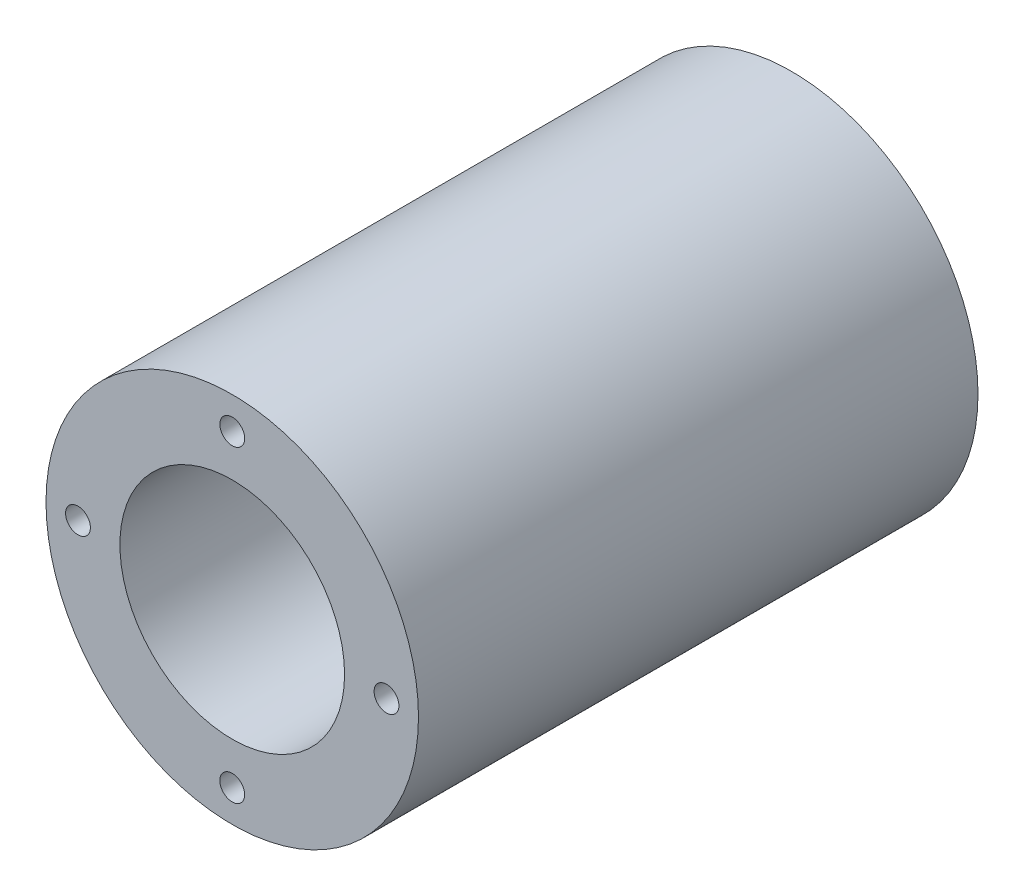
ISO-10303-21;
HEADER;
FILE_DESCRIPTION(('STEP AP214'),'2;1');
FILE_NAME('part.step','',(''),(''),'','','');
FILE_SCHEMA(('AUTOMOTIVE_DESIGN { 1 0 10303 214 1 1 1 1 }'));
ENDSEC;
DATA;
#1=APPLICATION_CONTEXT('core data for automotive mechanical design processes');
#2=APPLICATION_PROTOCOL_DEFINITION('international standard','automotive_design',2000,#1);
#3=PRODUCT_CONTEXT('',#1,'mechanical');
#4=PRODUCT('Part','Part','',(#3));
#5=PRODUCT_RELATED_PRODUCT_CATEGORY('part','',(#4));
#6=PRODUCT_DEFINITION_FORMATION('','',#4);
#7=PRODUCT_DEFINITION_CONTEXT('part definition',#1,'design');
#8=PRODUCT_DEFINITION('design','',#6,#7);
#9=PRODUCT_DEFINITION_SHAPE('','',#8);
#10=(LENGTH_UNIT() NAMED_UNIT(*) SI_UNIT(.MILLI.,.METRE.));
#11=(NAMED_UNIT(*) PLANE_ANGLE_UNIT() SI_UNIT($,.RADIAN.));
#12=(NAMED_UNIT(*) SI_UNIT($,.STERADIAN.) SOLID_ANGLE_UNIT());
#13=UNCERTAINTY_MEASURE_WITH_UNIT(LENGTH_MEASURE(1.E-05),#10,'distance_accuracy_value','');
#14=(GEOMETRIC_REPRESENTATION_CONTEXT(3) GLOBAL_UNCERTAINTY_ASSIGNED_CONTEXT((#13)) GLOBAL_UNIT_ASSIGNED_CONTEXT((#10,
#11,#12)) REPRESENTATION_CONTEXT('',''));
#15=CARTESIAN_POINT('',(0.,0.,0.));
#16=DIRECTION('',(0.,0.,1.));
#17=DIRECTION('',(1.,0.,0.));
#18=AXIS2_PLACEMENT_3D('',#15,#16,#17);
#19=CARTESIAN_POINT('',(0.,0.,23.625));
#20=DIRECTION('',(0.,0.,-1.));
#21=DIRECTION('',(-1.,0.,0.));
#22=AXIS2_PLACEMENT_3D('',#19,#20,#21);
#23=PLANE('',#22);
#24=CARTESIAN_POINT('',(0.,0.,23.625));
#25=DIRECTION('',(0.,0.,1.));
#26=DIRECTION('',(1.,0.,0.));
#27=AXIS2_PLACEMENT_3D('',#24,#25,#26);
#28=CIRCLE('',#27,22.6187);
#29=CARTESIAN_POINT('',(22.6187,0.,23.625));
#30=VERTEX_POINT('',#29);
#31=EDGE_CURVE('E48',#30,#30,#28,.T.);
#32=ORIENTED_EDGE('',*,*,#31,.T.);
#33=EDGE_LOOP('',(#32));
#34=FACE_BOUND('',#33,.T.);
#35=CARTESIAN_POINT('',(0.,0.,23.625));
#36=DIRECTION('',(0.,0.,-1.));
#37=DIRECTION('',(0.,1.,0.));
#38=AXIS2_PLACEMENT_3D('',#35,#36,#37);
#39=CIRCLE('',#38,25.4);
#40=CARTESIAN_POINT('',(0.,25.4,23.625));
#41=VERTEX_POINT('',#40);
#42=EDGE_CURVE('E499',#41,#41,#39,.T.);
#43=ORIENTED_EDGE('',*,*,#42,.T.);
#44=EDGE_LOOP('',(#43));
#45=FACE_BOUND('',#44,.T.);
#46=ADVANCED_FACE('F39',(#34,#45),#23,.T.);
#47=CARTESIAN_POINT('',(0.,0.,136.284));
#48=DIRECTION('',(0.,0.,-1.));
#49=DIRECTION('',(-1.,0.,0.));
#50=AXIS2_PLACEMENT_3D('',#47,#48,#49);
#51=PLANE('',#50);
#52=CARTESIAN_POINT('',(-31.05935,3.25329422764792E-13,136.284));
#53=DIRECTION('',(0.,0.,1.));
#54=DIRECTION('',(1.,0.,0.));
#55=AXIS2_PLACEMENT_3D('',#52,#53,#54);
#56=CIRCLE('',#55,2.5);
#57=CARTESIAN_POINT('',(-28.55935,3.25329422764792E-13,136.284));
#58=VERTEX_POINT('',#57);
#59=EDGE_CURVE('E90',#58,#58,#56,.T.);
#60=ORIENTED_EDGE('',*,*,#59,.F.);
#61=EDGE_LOOP('',(#60));
#62=FACE_BOUND('',#61,.T.);
#63=CARTESIAN_POINT('',(0.,-31.05935,136.284));
#64=DIRECTION('',(0.,0.,1.));
#65=DIRECTION('',(1.,0.,0.));
#66=AXIS2_PLACEMENT_3D('',#63,#64,#65);
#67=CIRCLE('',#66,2.5);
#68=CARTESIAN_POINT('',(2.5,-31.05935,136.284));
#69=VERTEX_POINT('',#68);
#70=EDGE_CURVE('E89',#69,#69,#67,.T.);
#71=ORIENTED_EDGE('',*,*,#70,.F.);
#72=EDGE_LOOP('',(#71));
#73=FACE_BOUND('',#72,.T.);
#74=CARTESIAN_POINT('',(31.05935,-1.08443140921597E-13,136.284));
#75=DIRECTION('',(0.,0.,1.));
#76=DIRECTION('',(1.,0.,0.));
#77=AXIS2_PLACEMENT_3D('',#74,#75,#76);
#78=CIRCLE('',#77,2.5);
#79=CARTESIAN_POINT('',(33.55935,-1.08443140921597E-13,136.284));
#80=VERTEX_POINT('',#79);
#81=EDGE_CURVE('E102',#80,#80,#78,.T.);
#82=ORIENTED_EDGE('',*,*,#81,.F.);
#83=EDGE_LOOP('',(#82));
#84=FACE_BOUND('',#83,.T.);
#85=CARTESIAN_POINT('',(0.,31.05935,136.284));
#86=DIRECTION('',(0.,0.,1.));
#87=DIRECTION('',(1.,0.,0.));
#88=AXIS2_PLACEMENT_3D('',#85,#86,#87);
#89=CIRCLE('',#88,2.5);
#90=CARTESIAN_POINT('',(2.5,31.05935,136.284));
#91=VERTEX_POINT('',#90);
#92=EDGE_CURVE('E108',#91,#91,#89,.T.);
#93=ORIENTED_EDGE('',*,*,#92,.F.);
#94=EDGE_LOOP('',(#93));
#95=FACE_BOUND('',#94,.T.);
#96=CARTESIAN_POINT('',(0.,0.,136.284));
#97=DIRECTION('',(0.,0.,1.));
#98=DIRECTION('',(1.,0.,0.));
#99=AXIS2_PLACEMENT_3D('',#96,#97,#98);
#100=CIRCLE('',#99,22.6187);
#101=CARTESIAN_POINT('',(22.6187,0.,136.284));
#102=VERTEX_POINT('',#101);
#103=EDGE_CURVE('E11',#102,#102,#100,.T.);
#104=ORIENTED_EDGE('',*,*,#103,.F.);
#105=EDGE_LOOP('',(#104));
#106=FACE_BOUND('',#105,.T.);
#107=CARTESIAN_POINT('',(0.,0.,136.284));
#108=DIRECTION('',(0.,0.,1.));
#109=DIRECTION('',(1.,0.,0.));
#110=AXIS2_PLACEMENT_3D('',#107,#108,#109);
#111=CIRCLE('',#110,37.5);
#112=CARTESIAN_POINT('',(37.5,0.,136.284));
#113=VERTEX_POINT('',#112);
#114=EDGE_CURVE('E151',#113,#113,#111,.T.);
#115=ORIENTED_EDGE('',*,*,#114,.T.);
#116=EDGE_LOOP('',(#115));
#117=FACE_BOUND('',#116,.T.);
#118=ADVANCED_FACE('F41',(#62,#73,#84,#95,#106,#117),#51,.F.);
#119=CARTESIAN_POINT('',(0.,0.,136.284));
#120=DIRECTION('',(0.,0.,1.));
#121=DIRECTION('',(1.,0.,0.));
#122=AXIS2_PLACEMENT_3D('',#119,#120,#121);
#123=CYLINDRICAL_SURFACE('',#122,22.6187);
#124=ORIENTED_EDGE('',*,*,#31,.F.);
#125=EDGE_LOOP('',(#124));
#126=FACE_BOUND('',#125,.T.);
#127=ORIENTED_EDGE('',*,*,#103,.T.);
#128=EDGE_LOOP('',(#127));
#129=FACE_BOUND('',#128,.T.);
#130=ADVANCED_FACE('F165',(#126,#129),#123,.F.);
#131=CARTESIAN_POINT('',(0.,0.,23.625));
#132=DIRECTION('',(0.,0.,-1.));
#133=DIRECTION('',(0.,1.,0.));
#134=AXIS2_PLACEMENT_3D('',#131,#132,#133);
#135=CIRCLE('',#134,26.9875);
#136=CARTESIAN_POINT('',(0.,26.9875,23.625));
#137=VERTEX_POINT('',#136);
#138=EDGE_CURVE('E493',#137,#137,#135,.T.);
#139=ORIENTED_EDGE('',*,*,#138,.F.);
#140=EDGE_LOOP('',(#139));
#141=FACE_BOUND('',#140,.T.);
#142=CARTESIAN_POINT('',(-26.898186125032,15.5296750000003,23.625));
#143=DIRECTION('',(0.,0.,-1.));
#144=DIRECTION('',(-1.,0.,0.));
#145=AXIS2_PLACEMENT_3D('',#142,#143,#144);
#146=CIRCLE('',#145,2.49999999999999);
#147=CARTESIAN_POINT('',(-29.398186125032,15.5296750000003,23.625));
#148=VERTEX_POINT('',#147);
#149=EDGE_CURVE('E114',#148,#148,#146,.T.);
#150=ORIENTED_EDGE('',*,*,#149,.F.);
#151=EDGE_LOOP('',(#150));
#152=FACE_BOUND('',#151,.T.);
#153=CARTESIAN_POINT('',(-26.8981861250323,-15.5296749999998,23.625));
#154=DIRECTION('',(0.,0.,-1.));
#155=DIRECTION('',(-1.,0.,0.));
#156=AXIS2_PLACEMENT_3D('',#153,#154,#155);
#157=CIRCLE('',#156,2.49999999999999);
#158=CARTESIAN_POINT('',(-29.3981861250323,-15.5296749999998,23.625));
#159=VERTEX_POINT('',#158);
#160=EDGE_CURVE('E120',#159,#159,#157,.T.);
#161=ORIENTED_EDGE('',*,*,#160,.F.);
#162=EDGE_LOOP('',(#161));
#163=FACE_BOUND('',#162,.T.);
#164=CARTESIAN_POINT('',(0.,-31.05935,23.625));
#165=DIRECTION('',(0.,0.,-1.));
#166=DIRECTION('',(-1.,0.,0.));
#167=AXIS2_PLACEMENT_3D('',#164,#165,#166);
#168=CIRCLE('',#167,2.49999999999999);
#169=CARTESIAN_POINT('',(-2.49999999999999,-31.05935,23.625));
#170=VERTEX_POINT('',#169);
#171=EDGE_CURVE('E127',#170,#170,#168,.T.);
#172=ORIENTED_EDGE('',*,*,#171,.F.);
#173=EDGE_LOOP('',(#172));
#174=FACE_BOUND('',#173,.T.);
#175=CARTESIAN_POINT('',(26.8981861250321,-15.5296750000001,23.625));
#176=DIRECTION('',(0.,0.,-1.));
#177=DIRECTION('',(-1.,0.,0.));
#178=AXIS2_PLACEMENT_3D('',#175,#176,#177);
#179=CIRCLE('',#178,2.49999999999999);
#180=CARTESIAN_POINT('',(24.3981861250321,-15.5296750000001,23.625));
#181=VERTEX_POINT('',#180);
#182=EDGE_CURVE('E133',#181,#181,#179,.T.);
#183=ORIENTED_EDGE('',*,*,#182,.F.);
#184=EDGE_LOOP('',(#183));
#185=FACE_BOUND('',#184,.T.);
#186=CARTESIAN_POINT('',(26.8981861250322,15.5296749999999,23.625));
#187=DIRECTION('',(0.,0.,-1.));
#188=DIRECTION('',(-1.,0.,0.));
#189=AXIS2_PLACEMENT_3D('',#186,#187,#188);
#190=CIRCLE('',#189,2.49999999999999);
#191=CARTESIAN_POINT('',(24.3981861250323,15.5296749999999,23.625));
#192=VERTEX_POINT('',#191);
#193=EDGE_CURVE('E139',#192,#192,#190,.T.);
#194=ORIENTED_EDGE('',*,*,#193,.F.);
#195=EDGE_LOOP('',(#194));
#196=FACE_BOUND('',#195,.T.);
#197=CARTESIAN_POINT('',(0.,31.05935,23.625));
#198=DIRECTION('',(0.,0.,-1.));
#199=DIRECTION('',(-1.,0.,0.));
#200=AXIS2_PLACEMENT_3D('',#197,#198,#199);
#201=CIRCLE('',#200,2.49999999999999);
#202=CARTESIAN_POINT('',(-2.49999999999999,31.05935,23.625));
#203=VERTEX_POINT('',#202);
#204=EDGE_CURVE('E145',#203,#203,#201,.T.);
#205=ORIENTED_EDGE('',*,*,#204,.F.);
#206=EDGE_LOOP('',(#205));
#207=FACE_BOUND('',#206,.T.);
#208=CARTESIAN_POINT('',(0.,0.,23.625));
#209=DIRECTION('',(0.,0.,1.));
#210=DIRECTION('',(1.,0.,0.));
#211=AXIS2_PLACEMENT_3D('',#208,#209,#210);
#212=CIRCLE('',#211,37.5);
#213=CARTESIAN_POINT('',(37.5,0.,23.625));
#214=VERTEX_POINT('',#213);
#215=EDGE_CURVE('E154',#214,#214,#212,.T.);
#216=ORIENTED_EDGE('',*,*,#215,.F.);
#217=EDGE_LOOP('',(#216));
#218=FACE_BOUND('',#217,.T.);
#219=ADVANCED_FACE('F168',(#141,#152,#163,#174,#185,#196,#207,#218),#23,.T.);
#220=CARTESIAN_POINT('',(0.,0.,136.284));
#221=DIRECTION('',(0.,0.,1.));
#222=DIRECTION('',(1.,0.,0.));
#223=AXIS2_PLACEMENT_3D('',#220,#221,#222);
#224=CYLINDRICAL_SURFACE('',#223,37.5);
#225=ORIENTED_EDGE('',*,*,#215,.T.);
#226=EDGE_LOOP('',(#225));
#227=FACE_BOUND('',#226,.T.);
#228=ORIENTED_EDGE('',*,*,#114,.F.);
#229=EDGE_LOOP('',(#228));
#230=FACE_BOUND('',#229,.T.);
#231=ADVANCED_FACE('F176',(#227,#230),#224,.T.);
#232=CARTESIAN_POINT('',(0.,31.05935,38.625));
#233=DIRECTION('',(0.,0.,-1.));
#234=DIRECTION('',(-1.,0.,0.));
#235=AXIS2_PLACEMENT_3D('',#232,#233,#234);
#236=CONICAL_SURFACE('',#235,2.49999999999999,1.02974425867665);
#237=CARTESIAN_POINT('',(0.,31.05935,40.1271515475689));
#238=VERTEX_POINT('',#237);
#239=VERTEX_LOOP('',#238);
#240=FACE_BOUND('',#239,.T.);
#241=CARTESIAN_POINT('',(0.,31.05935,38.625));
#242=DIRECTION('',(0.,0.,-1.));
#243=DIRECTION('',(-1.,0.,0.));
#244=AXIS2_PLACEMENT_3D('',#241,#242,#243);
#245=CIRCLE('',#244,2.49999999999999);
#246=CARTESIAN_POINT('',(-2.49999999999999,31.05935,38.625));
#247=VERTEX_POINT('',#246);
#248=EDGE_CURVE('E148',#247,#247,#245,.T.);
#249=ORIENTED_EDGE('',*,*,#248,.T.);
#250=EDGE_LOOP('',(#249));
#251=FACE_BOUND('',#250,.T.);
#252=ADVANCED_FACE('F178',(#240,#251),#236,.F.);
#253=CARTESIAN_POINT('',(0.,31.05935,23.625));
#254=DIRECTION('',(0.,0.,-1.));
#255=DIRECTION('',(-1.,0.,0.));
#256=AXIS2_PLACEMENT_3D('',#253,#254,#255);
#257=CYLINDRICAL_SURFACE('',#256,2.49999999999999);
#258=ORIENTED_EDGE('',*,*,#248,.F.);
#259=EDGE_LOOP('',(#258));
#260=FACE_BOUND('',#259,.T.);
#261=ORIENTED_EDGE('',*,*,#204,.T.);
#262=EDGE_LOOP('',(#261));
#263=FACE_BOUND('',#262,.T.);
#264=ADVANCED_FACE('F185',(#260,#263),#257,.F.);
#265=CARTESIAN_POINT('',(26.8981861250322,15.5296749999999,38.625));
#266=DIRECTION('',(0.,0.,-1.));
#267=DIRECTION('',(-1.,0.,0.));
#268=AXIS2_PLACEMENT_3D('',#265,#266,#267);
#269=CONICAL_SURFACE('',#268,2.49999999999999,1.02974425867665);
#270=CARTESIAN_POINT('',(26.8981861250322,15.5296749999999,40.1271515475689));
#271=VERTEX_POINT('',#270);
#272=VERTEX_LOOP('',#271);
#273=FACE_BOUND('',#272,.T.);
#274=CARTESIAN_POINT('',(26.8981861250322,15.5296749999999,38.625));
#275=DIRECTION('',(0.,0.,-1.));
#276=DIRECTION('',(-1.,0.,0.));
#277=AXIS2_PLACEMENT_3D('',#274,#275,#276);
#278=CIRCLE('',#277,2.49999999999999);
#279=CARTESIAN_POINT('',(24.3981861250323,15.5296749999999,38.625));
#280=VERTEX_POINT('',#279);
#281=EDGE_CURVE('E142',#280,#280,#278,.T.);
#282=ORIENTED_EDGE('',*,*,#281,.T.);
#283=EDGE_LOOP('',(#282));
#284=FACE_BOUND('',#283,.T.);
#285=ADVANCED_FACE('F361',(#273,#284),#269,.F.);
#286=CARTESIAN_POINT('',(26.8981861250322,15.5296749999999,23.625));
#287=DIRECTION('',(0.,0.,-1.));
#288=DIRECTION('',(-1.,0.,0.));
#289=AXIS2_PLACEMENT_3D('',#286,#287,#288);
#290=CYLINDRICAL_SURFACE('',#289,2.49999999999999);
#291=ORIENTED_EDGE('',*,*,#281,.F.);
#292=EDGE_LOOP('',(#291));
#293=FACE_BOUND('',#292,.T.);
#294=ORIENTED_EDGE('',*,*,#193,.T.);
#295=EDGE_LOOP('',(#294));
#296=FACE_BOUND('',#295,.T.);
#297=ADVANCED_FACE('F353',(#293,#296),#290,.F.);
#298=CARTESIAN_POINT('',(26.8981861250321,-15.5296750000001,38.625));
#299=DIRECTION('',(0.,0.,-1.));
#300=DIRECTION('',(-1.,0.,0.));
#301=AXIS2_PLACEMENT_3D('',#298,#299,#300);
#302=CONICAL_SURFACE('',#301,2.49999999999998,1.02974425867665);
#303=CARTESIAN_POINT('',(26.8981861250321,-15.5296750000001,40.1271515475689));
#304=VERTEX_POINT('',#303);
#305=VERTEX_LOOP('',#304);
#306=FACE_BOUND('',#305,.T.);
#307=CARTESIAN_POINT('',(26.8981861250321,-15.5296750000001,38.625));
#308=DIRECTION('',(0.,0.,-1.));
#309=DIRECTION('',(-1.,0.,0.));
#310=AXIS2_PLACEMENT_3D('',#307,#308,#309);
#311=CIRCLE('',#310,2.49999999999998);
#312=CARTESIAN_POINT('',(24.3981861250322,-15.5296750000001,38.625));
#313=VERTEX_POINT('',#312);
#314=EDGE_CURVE('E136',#313,#313,#311,.T.);
#315=ORIENTED_EDGE('',*,*,#314,.T.);
#316=EDGE_LOOP('',(#315));
#317=FACE_BOUND('',#316,.T.);
#318=ADVANCED_FACE('F345',(#306,#317),#302,.F.);
#319=CARTESIAN_POINT('',(26.8981861250321,-15.5296750000001,23.625));
#320=DIRECTION('',(0.,0.,-1.));
#321=DIRECTION('',(-1.,0.,0.));
#322=AXIS2_PLACEMENT_3D('',#319,#320,#321);
#323=CYLINDRICAL_SURFACE('',#322,2.49999999999999);
#324=ORIENTED_EDGE('',*,*,#314,.F.);
#325=EDGE_LOOP('',(#324));
#326=FACE_BOUND('',#325,.T.);
#327=ORIENTED_EDGE('',*,*,#182,.T.);
#328=EDGE_LOOP('',(#327));
#329=FACE_BOUND('',#328,.T.);
#330=ADVANCED_FACE('F337',(#326,#329),#323,.F.);
#331=CARTESIAN_POINT('',(0.,-31.05935,38.625));
#332=DIRECTION('',(0.,0.,-1.));
#333=DIRECTION('',(-1.,0.,0.));
#334=AXIS2_PLACEMENT_3D('',#331,#332,#333);
#335=CONICAL_SURFACE('',#334,2.49999999999999,1.02974425867665);
#336=CARTESIAN_POINT('',(0.,-31.05935,40.1271515475689));
#337=VERTEX_POINT('',#336);
#338=VERTEX_LOOP('',#337);
#339=FACE_BOUND('',#338,.T.);
#340=CARTESIAN_POINT('',(0.,-31.05935,38.625));
#341=DIRECTION('',(0.,0.,-1.));
#342=DIRECTION('',(-1.,0.,0.));
#343=AXIS2_PLACEMENT_3D('',#340,#341,#342);
#344=CIRCLE('',#343,2.49999999999999);
#345=CARTESIAN_POINT('',(-2.49999999999999,-31.05935,38.625));
#346=VERTEX_POINT('',#345);
#347=EDGE_CURVE('E130',#346,#346,#344,.T.);
#348=ORIENTED_EDGE('',*,*,#347,.T.);
#349=EDGE_LOOP('',(#348));
#350=FACE_BOUND('',#349,.T.);
#351=ADVANCED_FACE('F329',(#339,#350),#335,.F.);
#352=CARTESIAN_POINT('',(0.,-31.05935,23.625));
#353=DIRECTION('',(0.,0.,-1.));
#354=DIRECTION('',(-1.,0.,0.));
#355=AXIS2_PLACEMENT_3D('',#352,#353,#354);
#356=CYLINDRICAL_SURFACE('',#355,2.49999999999999);
#357=ORIENTED_EDGE('',*,*,#347,.F.);
#358=EDGE_LOOP('',(#357));
#359=FACE_BOUND('',#358,.T.);
#360=ORIENTED_EDGE('',*,*,#171,.T.);
#361=EDGE_LOOP('',(#360));
#362=FACE_BOUND('',#361,.T.);
#363=ADVANCED_FACE('F321',(#359,#362),#356,.F.);
#364=CARTESIAN_POINT('',(-26.8981861250323,-15.5296749999998,38.625));
#365=DIRECTION('',(0.,0.,-1.));
#366=DIRECTION('',(-1.,0.,0.));
#367=AXIS2_PLACEMENT_3D('',#364,#365,#366);
#368=CONICAL_SURFACE('',#367,2.49999999999998,1.02974425867665);
#369=CARTESIAN_POINT('',(-26.8981861250323,-15.5296749999998,40.1271515475689));
#370=VERTEX_POINT('',#369);
#371=VERTEX_LOOP('',#370);
#372=FACE_BOUND('',#371,.T.);
#373=CARTESIAN_POINT('',(-26.8981861250323,-15.5296749999998,38.625));
#374=DIRECTION('',(0.,0.,-1.));
#375=DIRECTION('',(-1.,0.,0.));
#376=AXIS2_PLACEMENT_3D('',#373,#374,#375);
#377=CIRCLE('',#376,2.49999999999998);
#378=CARTESIAN_POINT('',(-29.3981861250323,-15.5296749999998,38.625));
#379=VERTEX_POINT('',#378);
#380=EDGE_CURVE('E124',#379,#379,#377,.T.);
#381=ORIENTED_EDGE('',*,*,#380,.T.);
#382=EDGE_LOOP('',(#381));
#383=FACE_BOUND('',#382,.T.);
#384=ADVANCED_FACE('F313',(#372,#383),#368,.F.);
#385=CARTESIAN_POINT('',(-26.8981861250323,-15.5296749999998,23.625));
#386=DIRECTION('',(0.,0.,-1.));
#387=DIRECTION('',(-1.,0.,0.));
#388=AXIS2_PLACEMENT_3D('',#385,#386,#387);
#389=CYLINDRICAL_SURFACE('',#388,2.49999999999999);
#390=ORIENTED_EDGE('',*,*,#380,.F.);
#391=EDGE_LOOP('',(#390));
#392=FACE_BOUND('',#391,.T.);
#393=ORIENTED_EDGE('',*,*,#160,.T.);
#394=EDGE_LOOP('',(#393));
#395=FACE_BOUND('',#394,.T.);
#396=ADVANCED_FACE('F305',(#392,#395),#389,.F.);
#397=CARTESIAN_POINT('',(-26.898186125032,15.5296750000003,38.625));
#398=DIRECTION('',(0.,0.,-1.));
#399=DIRECTION('',(-1.,0.,0.));
#400=AXIS2_PLACEMENT_3D('',#397,#398,#399);
#401=CONICAL_SURFACE('',#400,2.49999999999999,1.02974425867665);
#402=CARTESIAN_POINT('',(-26.898186125032,15.5296750000003,40.1271515475689));
#403=VERTEX_POINT('',#402);
#404=VERTEX_LOOP('',#403);
#405=FACE_BOUND('',#404,.T.);
#406=CARTESIAN_POINT('',(-26.898186125032,15.5296750000003,38.625));
#407=DIRECTION('',(0.,0.,-1.));
#408=DIRECTION('',(-1.,0.,0.));
#409=AXIS2_PLACEMENT_3D('',#406,#407,#408);
#410=CIRCLE('',#409,2.49999999999999);
#411=CARTESIAN_POINT('',(-29.398186125032,15.5296750000003,38.625));
#412=VERTEX_POINT('',#411);
#413=EDGE_CURVE('E117',#412,#412,#410,.T.);
#414=ORIENTED_EDGE('',*,*,#413,.T.);
#415=EDGE_LOOP('',(#414));
#416=FACE_BOUND('',#415,.T.);
#417=ADVANCED_FACE('F297',(#405,#416),#401,.F.);
#418=CARTESIAN_POINT('',(-26.898186125032,15.5296750000003,23.625));
#419=DIRECTION('',(0.,0.,-1.));
#420=DIRECTION('',(-1.,0.,0.));
#421=AXIS2_PLACEMENT_3D('',#418,#419,#420);
#422=CYLINDRICAL_SURFACE('',#421,2.49999999999999);
#423=ORIENTED_EDGE('',*,*,#413,.F.);
#424=EDGE_LOOP('',(#423));
#425=FACE_BOUND('',#424,.T.);
#426=ORIENTED_EDGE('',*,*,#149,.T.);
#427=EDGE_LOOP('',(#426));
#428=FACE_BOUND('',#427,.T.);
#429=ADVANCED_FACE('F289',(#425,#428),#422,.F.);
#430=CARTESIAN_POINT('',(0.,31.05935,121.284));
#431=DIRECTION('',(0.,0.,1.));
#432=DIRECTION('',(1.,0.,0.));
#433=AXIS2_PLACEMENT_3D('',#430,#431,#432);
#434=CONICAL_SURFACE('',#433,2.5,1.02974425867665);
#435=CARTESIAN_POINT('',(0.,31.05935,119.781848452431));
#436=VERTEX_POINT('',#435);
#437=VERTEX_LOOP('',#436);
#438=FACE_BOUND('',#437,.T.);
#439=CARTESIAN_POINT('',(0.,31.05935,121.284));
#440=DIRECTION('',(0.,0.,1.));
#441=DIRECTION('',(1.,0.,0.));
#442=AXIS2_PLACEMENT_3D('',#439,#440,#441);
#443=CIRCLE('',#442,2.5);
#444=CARTESIAN_POINT('',(2.5,31.05935,121.284));
#445=VERTEX_POINT('',#444);
#446=EDGE_CURVE('E111',#445,#445,#443,.T.);
#447=ORIENTED_EDGE('',*,*,#446,.T.);
#448=EDGE_LOOP('',(#447));
#449=FACE_BOUND('',#448,.T.);
#450=ADVANCED_FACE('F281',(#438,#449),#434,.F.);
#451=CARTESIAN_POINT('',(0.,31.05935,136.284));
#452=DIRECTION('',(0.,0.,1.));
#453=DIRECTION('',(1.,0.,0.));
#454=AXIS2_PLACEMENT_3D('',#451,#452,#453);
#455=CYLINDRICAL_SURFACE('',#454,2.5);
#456=ORIENTED_EDGE('',*,*,#446,.F.);
#457=EDGE_LOOP('',(#456));
#458=FACE_BOUND('',#457,.T.);
#459=ORIENTED_EDGE('',*,*,#92,.T.);
#460=EDGE_LOOP('',(#459));
#461=FACE_BOUND('',#460,.T.);
#462=ADVANCED_FACE('F274',(#458,#461),#455,.F.);
#463=CARTESIAN_POINT('',(31.05935,-1.08443140921597E-13,121.284));
#464=DIRECTION('',(0.,0.,1.));
#465=DIRECTION('',(1.,0.,0.));
#466=AXIS2_PLACEMENT_3D('',#463,#464,#465);
#467=CONICAL_SURFACE('',#466,2.5,1.02974425867665);
#468=CARTESIAN_POINT('',(31.05935,-1.08443140921597E-13,119.781848452431));
#469=VERTEX_POINT('',#468);
#470=VERTEX_LOOP('',#469);
#471=FACE_BOUND('',#470,.T.);
#472=CARTESIAN_POINT('',(31.05935,-1.08443140921597E-13,121.284));
#473=DIRECTION('',(0.,0.,1.));
#474=DIRECTION('',(1.,0.,0.));
#475=AXIS2_PLACEMENT_3D('',#472,#473,#474);
#476=CIRCLE('',#475,2.5);
#477=CARTESIAN_POINT('',(33.55935,-1.08443140921597E-13,121.284));
#478=VERTEX_POINT('',#477);
#479=EDGE_CURVE('E105',#478,#478,#476,.T.);
#480=ORIENTED_EDGE('',*,*,#479,.T.);
#481=EDGE_LOOP('',(#480));
#482=FACE_BOUND('',#481,.T.);
#483=ADVANCED_FACE('F267',(#471,#482),#467,.F.);
#484=CARTESIAN_POINT('',(31.05935,-1.08443140921597E-13,136.284));
#485=DIRECTION('',(0.,0.,1.));
#486=DIRECTION('',(1.,0.,0.));
#487=AXIS2_PLACEMENT_3D('',#484,#485,#486);
#488=CYLINDRICAL_SURFACE('',#487,2.5);
#489=ORIENTED_EDGE('',*,*,#479,.F.);
#490=EDGE_LOOP('',(#489));
#491=FACE_BOUND('',#490,.T.);
#492=ORIENTED_EDGE('',*,*,#81,.T.);
#493=EDGE_LOOP('',(#492));
#494=FACE_BOUND('',#493,.T.);
#495=ADVANCED_FACE('F259',(#491,#494),#488,.F.);
#496=CARTESIAN_POINT('',(0.,-31.05935,121.284));
#497=DIRECTION('',(0.,0.,1.));
#498=DIRECTION('',(1.,0.,0.));
#499=AXIS2_PLACEMENT_3D('',#496,#497,#498);
#500=CONICAL_SURFACE('',#499,2.5,1.02974425867665);
#501=CARTESIAN_POINT('',(0.,-31.05935,119.781848452431));
#502=VERTEX_POINT('',#501);
#503=VERTEX_LOOP('',#502);
#504=FACE_BOUND('',#503,.T.);
#505=CARTESIAN_POINT('',(0.,-31.05935,121.284));
#506=DIRECTION('',(0.,0.,1.));
#507=DIRECTION('',(1.,0.,0.));
#508=AXIS2_PLACEMENT_3D('',#505,#506,#507);
#509=CIRCLE('',#508,2.5);
#510=CARTESIAN_POINT('',(2.5,-31.05935,121.284));
#511=VERTEX_POINT('',#510);
#512=EDGE_CURVE('E93',#511,#511,#509,.T.);
#513=ORIENTED_EDGE('',*,*,#512,.T.);
#514=EDGE_LOOP('',(#513));
#515=FACE_BOUND('',#514,.T.);
#516=ADVANCED_FACE('F251',(#504,#515),#500,.F.);
#517=CARTESIAN_POINT('',(0.,-31.05935,136.284));
#518=DIRECTION('',(0.,0.,1.));
#519=DIRECTION('',(1.,0.,0.));
#520=AXIS2_PLACEMENT_3D('',#517,#518,#519);
#521=CYLINDRICAL_SURFACE('',#520,2.5);
#522=ORIENTED_EDGE('',*,*,#512,.F.);
#523=EDGE_LOOP('',(#522));
#524=FACE_BOUND('',#523,.T.);
#525=ORIENTED_EDGE('',*,*,#70,.T.);
#526=EDGE_LOOP('',(#525));
#527=FACE_BOUND('',#526,.T.);
#528=ADVANCED_FACE('F83',(#524,#527),#521,.F.);
#529=CARTESIAN_POINT('',(-31.05935,3.25329422764792E-13,121.284));
#530=DIRECTION('',(0.,0.,1.));
#531=DIRECTION('',(1.,0.,0.));
#532=AXIS2_PLACEMENT_3D('',#529,#530,#531);
#533=CONICAL_SURFACE('',#532,2.5,1.02974425867665);
#534=CARTESIAN_POINT('',(-31.05935,3.25329422764792E-13,119.781848452431));
#535=VERTEX_POINT('',#534);
#536=VERTEX_LOOP('',#535);
#537=FACE_BOUND('',#536,.T.);
#538=CARTESIAN_POINT('',(-31.05935,3.25329422764792E-13,121.284));
#539=DIRECTION('',(0.,0.,1.));
#540=DIRECTION('',(1.,0.,0.));
#541=AXIS2_PLACEMENT_3D('',#538,#539,#540);
#542=CIRCLE('',#541,2.5);
#543=CARTESIAN_POINT('',(-28.55935,3.25329422764792E-13,121.284));
#544=VERTEX_POINT('',#543);
#545=EDGE_CURVE('E87',#544,#544,#542,.T.);
#546=ORIENTED_EDGE('',*,*,#545,.T.);
#547=EDGE_LOOP('',(#546));
#548=FACE_BOUND('',#547,.T.);
#549=ADVANCED_FACE('F79',(#537,#548),#533,.F.);
#550=CARTESIAN_POINT('',(-31.05935,3.25329422764792E-13,136.284));
#551=DIRECTION('',(0.,0.,1.));
#552=DIRECTION('',(1.,0.,0.));
#553=AXIS2_PLACEMENT_3D('',#550,#551,#552);
#554=CYLINDRICAL_SURFACE('',#553,2.5);
#555=ORIENTED_EDGE('',*,*,#545,.F.);
#556=EDGE_LOOP('',(#555));
#557=FACE_BOUND('',#556,.T.);
#558=ORIENTED_EDGE('',*,*,#59,.T.);
#559=EDGE_LOOP('',(#558));
#560=FACE_BOUND('',#559,.T.);
#561=ADVANCED_FACE('F82',(#557,#560),#554,.F.);
#562=CARTESIAN_POINT('',(0.,0.,24.125));
#563=DIRECTION('',(0.,0.,-1.));
#564=DIRECTION('',(0.,1.,0.));
#565=AXIS2_PLACEMENT_3D('',#562,#563,#564);
#566=CYLINDRICAL_SURFACE('',#565,26.9875);
#567=CARTESIAN_POINT('',(0.,0.,24.125));
#568=DIRECTION('',(0.,0.,-1.));
#569=DIRECTION('',(0.,1.,0.));
#570=AXIS2_PLACEMENT_3D('',#567,#568,#569);
#571=CIRCLE('',#570,26.9875);
#572=CARTESIAN_POINT('',(0.,26.9875,24.125));
#573=VERTEX_POINT('',#572);
#574=EDGE_CURVE('E96',#573,#573,#571,.T.);
#575=ORIENTED_EDGE('',*,*,#574,.F.);
#576=EDGE_LOOP('',(#575));
#577=FACE_BOUND('',#576,.T.);
#578=ORIENTED_EDGE('',*,*,#138,.T.);
#579=EDGE_LOOP('',(#578));
#580=FACE_BOUND('',#579,.T.);
#581=ADVANCED_FACE('F228',(#577,#580),#566,.F.);
#582=CARTESIAN_POINT('',(0.,0.,24.125));
#583=DIRECTION('',(0.,0.,-1.));
#584=DIRECTION('',(0.,1.,0.));
#585=AXIS2_PLACEMENT_3D('',#582,#583,#584);
#586=PLANE('',#585);
#587=CARTESIAN_POINT('',(0.,0.,24.125));
#588=DIRECTION('',(0.,0.,-1.));
#589=DIRECTION('',(0.,1.,0.));
#590=AXIS2_PLACEMENT_3D('',#587,#588,#589);
#591=CIRCLE('',#590,25.4);
#592=CARTESIAN_POINT('',(0.,25.4,24.125));
#593=VERTEX_POINT('',#592);
#594=EDGE_CURVE('E495',#593,#593,#591,.T.);
#595=ORIENTED_EDGE('',*,*,#594,.F.);
#596=EDGE_LOOP('',(#595));
#597=FACE_BOUND('',#596,.T.);
#598=ORIENTED_EDGE('',*,*,#574,.T.);
#599=EDGE_LOOP('',(#598));
#600=FACE_BOUND('',#599,.T.);
#601=ADVANCED_FACE('F218',(#597,#600),#586,.T.);
#602=CARTESIAN_POINT('',(0.,0.,24.125));
#603=DIRECTION('',(0.,0.,-1.));
#604=DIRECTION('',(0.,1.,0.));
#605=AXIS2_PLACEMENT_3D('',#602,#603,#604);
#606=CYLINDRICAL_SURFACE('',#605,25.4);
#607=ORIENTED_EDGE('',*,*,#594,.T.);
#608=EDGE_LOOP('',(#607));
#609=FACE_BOUND('',#608,.T.);
#610=ORIENTED_EDGE('',*,*,#42,.F.);
#611=EDGE_LOOP('',(#610));
#612=FACE_BOUND('',#611,.T.);
#613=ADVANCED_FACE('F215',(#609,#612),#606,.T.);
#614=CLOSED_SHELL('',(#46,#118,#130,#219,#231,#252,#264,#285,#297,#318,#330,#351,#363,#384,#396,
#417,#429,#450,#462,#483,#495,#516,#528,#549,#561,#581,#601,#613));
#615=MANIFOLD_SOLID_BREP('B2',#614);
#616=ADVANCED_BREP_SHAPE_REPRESENTATION('',(#18,#615),#14);
#617=SHAPE_DEFINITION_REPRESENTATION(#9,#616);
ENDSEC;
END-ISO-10303-21;
